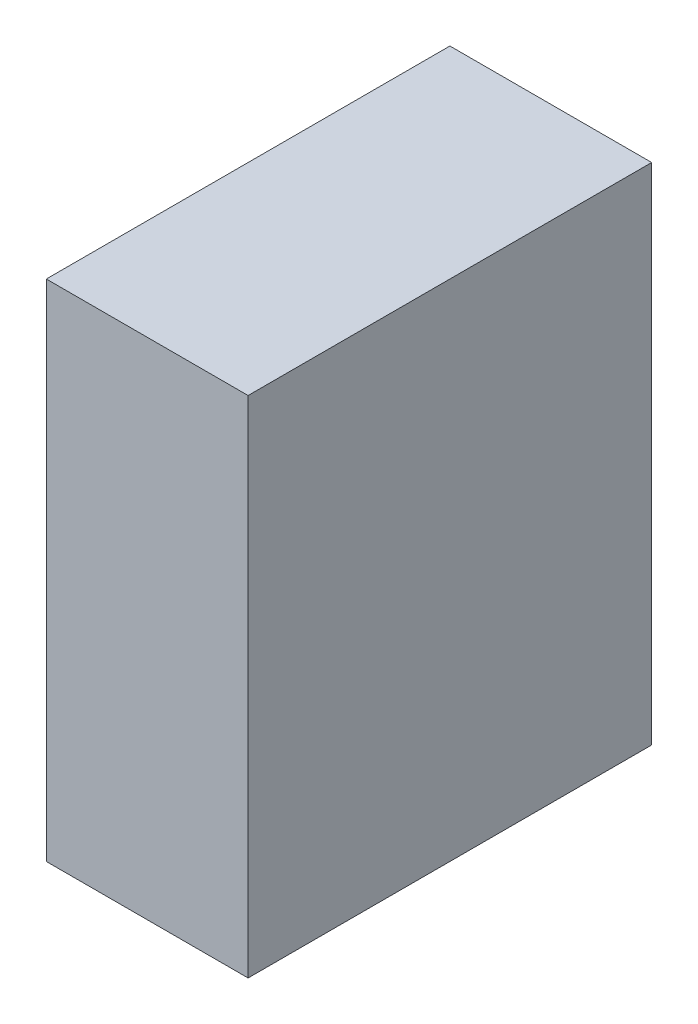
ISO-10303-21;
HEADER;
FILE_DESCRIPTION(('STEP AP214'),'2;1');
FILE_NAME('part.step','',(''),(''),'','','');
FILE_SCHEMA(('AUTOMOTIVE_DESIGN { 1 0 10303 214 1 1 1 1 }'));
ENDSEC;
DATA;
#1=APPLICATION_CONTEXT('core data for automotive mechanical design processes');
#2=APPLICATION_PROTOCOL_DEFINITION('international standard','automotive_design',2000,#1);
#3=PRODUCT_CONTEXT('',#1,'mechanical');
#4=PRODUCT('Part','Part','',(#3));
#5=PRODUCT_RELATED_PRODUCT_CATEGORY('part','',(#4));
#6=PRODUCT_DEFINITION_FORMATION('','',#4);
#7=PRODUCT_DEFINITION_CONTEXT('part definition',#1,'design');
#8=PRODUCT_DEFINITION('design','',#6,#7);
#9=PRODUCT_DEFINITION_SHAPE('','',#8);
#10=(LENGTH_UNIT() NAMED_UNIT(*) SI_UNIT(.MILLI.,.METRE.));
#11=(NAMED_UNIT(*) PLANE_ANGLE_UNIT() SI_UNIT($,.RADIAN.));
#12=(NAMED_UNIT(*) SI_UNIT($,.STERADIAN.) SOLID_ANGLE_UNIT());
#13=UNCERTAINTY_MEASURE_WITH_UNIT(LENGTH_MEASURE(1.E-05),#10,'distance_accuracy_value','');
#14=(GEOMETRIC_REPRESENTATION_CONTEXT(3) GLOBAL_UNCERTAINTY_ASSIGNED_CONTEXT((#13)) GLOBAL_UNIT_ASSIGNED_CONTEXT((#10,
#11,#12)) REPRESENTATION_CONTEXT('',''));
#15=CARTESIAN_POINT('',(0.,0.,0.));
#16=DIRECTION('',(0.,0.,1.));
#17=DIRECTION('',(1.,0.,0.));
#18=AXIS2_PLACEMENT_3D('',#15,#16,#17);
#19=CARTESIAN_POINT('',(20.,100.,-40.));
#20=DIRECTION('',(-1.,0.,0.));
#21=DIRECTION('',(0.,0.,1.));
#22=AXIS2_PLACEMENT_3D('',#19,#20,#21);
#23=PLANE('',#22);
#24=DIRECTION('',(0.,0.,-1.));
#25=VECTOR('',#24,1.);
#26=CARTESIAN_POINT('',(20.,0.,-40.));
#27=LINE('',#26,#25);
#28=CARTESIAN_POINT('',(20.,0.,40.));
#29=VERTEX_POINT('',#28);
#30=CARTESIAN_POINT('',(20.,0.,-40.));
#31=VERTEX_POINT('',#30);
#32=EDGE_CURVE('E117',#29,#31,#27,.T.);
#33=ORIENTED_EDGE('',*,*,#32,.T.);
#34=DIRECTION('',(0.,-1.,0.));
#35=VECTOR('',#34,1.);
#36=CARTESIAN_POINT('',(20.,100.,-40.));
#37=LINE('',#36,#35);
#38=CARTESIAN_POINT('',(20.,100.,-40.));
#39=VERTEX_POINT('',#38);
#40=EDGE_CURVE('E11',#39,#31,#37,.T.);
#41=ORIENTED_EDGE('',*,*,#40,.F.);
#42=DIRECTION('',(0.,0.,-1.));
#43=VECTOR('',#42,1.);
#44=CARTESIAN_POINT('',(20.,100.,-40.));
#45=LINE('',#44,#43);
#46=CARTESIAN_POINT('',(20.,100.,40.));
#47=VERTEX_POINT('',#46);
#48=EDGE_CURVE('E101',#47,#39,#45,.T.);
#49=ORIENTED_EDGE('',*,*,#48,.F.);
#50=DIRECTION('',(0.,-1.,0.));
#51=VECTOR('',#50,1.);
#52=CARTESIAN_POINT('',(20.,100.,40.));
#53=LINE('',#52,#51);
#54=EDGE_CURVE('E113',#47,#29,#53,.T.);
#55=ORIENTED_EDGE('',*,*,#54,.T.);
#56=EDGE_LOOP('',(#33,#41,#49,#55));
#57=FACE_BOUND('',#56,.T.);
#58=ADVANCED_FACE('F49',(#57),#23,.F.);
#59=CARTESIAN_POINT('',(-20.,100.,-40.));
#60=DIRECTION('',(0.,0.,1.));
#61=DIRECTION('',(1.,0.,0.));
#62=AXIS2_PLACEMENT_3D('',#59,#60,#61);
#63=PLANE('',#62);
#64=DIRECTION('',(-1.,0.,0.));
#65=VECTOR('',#64,1.);
#66=CARTESIAN_POINT('',(-20.,0.,-40.));
#67=LINE('',#66,#65);
#68=CARTESIAN_POINT('',(-20.,0.,-40.));
#69=VERTEX_POINT('',#68);
#70=EDGE_CURVE('E106',#31,#69,#67,.T.);
#71=ORIENTED_EDGE('',*,*,#70,.T.);
#72=DIRECTION('',(0.,-1.,0.));
#73=VECTOR('',#72,1.);
#74=CARTESIAN_POINT('',(-20.,100.,-40.));
#75=LINE('',#74,#73);
#76=CARTESIAN_POINT('',(-20.,100.,-40.));
#77=VERTEX_POINT('',#76);
#78=EDGE_CURVE('E58',#77,#69,#75,.T.);
#79=ORIENTED_EDGE('',*,*,#78,.F.);
#80=DIRECTION('',(-1.,0.,0.));
#81=VECTOR('',#80,1.);
#82=CARTESIAN_POINT('',(-20.,100.,-40.));
#83=LINE('',#82,#81);
#84=EDGE_CURVE('E96',#39,#77,#83,.T.);
#85=ORIENTED_EDGE('',*,*,#84,.F.);
#86=ORIENTED_EDGE('',*,*,#40,.T.);
#87=EDGE_LOOP('',(#71,#79,#85,#86));
#88=FACE_BOUND('',#87,.T.);
#89=ADVANCED_FACE('F105',(#88),#63,.F.);
#90=CARTESIAN_POINT('',(-20.,100.,-40.));
#91=DIRECTION('',(1.,0.,0.));
#92=DIRECTION('',(0.,0.,-1.));
#93=AXIS2_PLACEMENT_3D('',#90,#91,#92);
#94=PLANE('',#93);
#95=DIRECTION('',(0.,0.,1.));
#96=VECTOR('',#95,1.);
#97=CARTESIAN_POINT('',(-20.,0.,-40.));
#98=LINE('',#97,#96);
#99=CARTESIAN_POINT('',(-20.,0.,40.));
#100=VERTEX_POINT('',#99);
#101=EDGE_CURVE('E83',#69,#100,#98,.T.);
#102=ORIENTED_EDGE('',*,*,#101,.T.);
#103=DIRECTION('',(0.,-1.,0.));
#104=VECTOR('',#103,1.);
#105=CARTESIAN_POINT('',(-20.,100.,40.));
#106=LINE('',#105,#104);
#107=CARTESIAN_POINT('',(-20.,100.,40.));
#108=VERTEX_POINT('',#107);
#109=EDGE_CURVE('E108',#108,#100,#106,.T.);
#110=ORIENTED_EDGE('',*,*,#109,.F.);
#111=DIRECTION('',(0.,0.,1.));
#112=VECTOR('',#111,1.);
#113=CARTESIAN_POINT('',(-20.,100.,-40.));
#114=LINE('',#113,#112);
#115=EDGE_CURVE('E99',#77,#108,#114,.T.);
#116=ORIENTED_EDGE('',*,*,#115,.F.);
#117=ORIENTED_EDGE('',*,*,#78,.T.);
#118=EDGE_LOOP('',(#102,#110,#116,#117));
#119=FACE_BOUND('',#118,.T.);
#120=ADVANCED_FACE('F109',(#119),#94,.F.);
#121=CARTESIAN_POINT('',(-20.,100.,40.));
#122=DIRECTION('',(0.,0.,-1.));
#123=DIRECTION('',(-1.,0.,0.));
#124=AXIS2_PLACEMENT_3D('',#121,#122,#123);
#125=PLANE('',#124);
#126=DIRECTION('',(1.,0.,0.));
#127=VECTOR('',#126,1.);
#128=CARTESIAN_POINT('',(-20.,0.,40.));
#129=LINE('',#128,#127);
#130=EDGE_CURVE('E89',#100,#29,#129,.T.);
#131=ORIENTED_EDGE('',*,*,#130,.T.);
#132=ORIENTED_EDGE('',*,*,#54,.F.);
#133=DIRECTION('',(1.,0.,0.));
#134=VECTOR('',#133,1.);
#135=CARTESIAN_POINT('',(-20.,100.,40.));
#136=LINE('',#135,#134);
#137=EDGE_CURVE('E66',#108,#47,#136,.T.);
#138=ORIENTED_EDGE('',*,*,#137,.F.);
#139=ORIENTED_EDGE('',*,*,#109,.T.);
#140=EDGE_LOOP('',(#131,#132,#138,#139));
#141=FACE_BOUND('',#140,.T.);
#142=ADVANCED_FACE('F131',(#141),#125,.F.);
#143=CARTESIAN_POINT('',(0.,100.,0.));
#144=DIRECTION('',(0.,1.,0.));
#145=DIRECTION('',(0.,0.,1.));
#146=AXIS2_PLACEMENT_3D('',#143,#144,#145);
#147=PLANE('',#146);
#148=ORIENTED_EDGE('',*,*,#48,.T.);
#149=ORIENTED_EDGE('',*,*,#84,.T.);
#150=ORIENTED_EDGE('',*,*,#115,.T.);
#151=ORIENTED_EDGE('',*,*,#137,.T.);
#152=EDGE_LOOP('',(#148,#149,#150,#151));
#153=FACE_BOUND('',#152,.T.);
#154=ADVANCED_FACE('F97',(#153),#147,.T.);
#155=CARTESIAN_POINT('',(0.,0.,0.));
#156=DIRECTION('',(0.,1.,0.));
#157=DIRECTION('',(0.,0.,1.));
#158=AXIS2_PLACEMENT_3D('',#155,#156,#157);
#159=PLANE('',#158);
#160=CARTESIAN_POINT('',(0.,0.,-22.));
#161=DIRECTION('',(0.,-1.,0.));
#162=DIRECTION('',(0.,0.,-1.));
#163=AXIS2_PLACEMENT_3D('',#160,#161,#162);
#164=CIRCLE('',#163,5.);
#165=CARTESIAN_POINT('',(0.,0.,-27.));
#166=VERTEX_POINT('',#165);
#167=EDGE_CURVE('E150',#166,#166,#164,.T.);
#168=ORIENTED_EDGE('',*,*,#167,.F.);
#169=EDGE_LOOP('',(#168));
#170=FACE_BOUND('',#169,.T.);
#171=CARTESIAN_POINT('',(0.,0.,22.));
#172=DIRECTION('',(0.,-1.,0.));
#173=DIRECTION('',(0.,0.,-1.));
#174=AXIS2_PLACEMENT_3D('',#171,#172,#173);
#175=CIRCLE('',#174,5.);
#176=CARTESIAN_POINT('',(0.,0.,17.));
#177=VERTEX_POINT('',#176);
#178=EDGE_CURVE('E142',#177,#177,#175,.T.);
#179=ORIENTED_EDGE('',*,*,#178,.F.);
#180=EDGE_LOOP('',(#179));
#181=FACE_BOUND('',#180,.T.);
#182=CARTESIAN_POINT('',(0.,0.,0.));
#183=DIRECTION('',(0.,-1.,0.));
#184=DIRECTION('',(0.,0.,-1.));
#185=AXIS2_PLACEMENT_3D('',#182,#183,#184);
#186=CIRCLE('',#185,10.);
#187=CARTESIAN_POINT('',(0.,0.,-10.));
#188=VERTEX_POINT('',#187);
#189=EDGE_CURVE('E138',#188,#188,#186,.T.);
#190=ORIENTED_EDGE('',*,*,#189,.F.);
#191=EDGE_LOOP('',(#190));
#192=FACE_BOUND('',#191,.T.);
#193=ORIENTED_EDGE('',*,*,#32,.F.);
#194=ORIENTED_EDGE('',*,*,#130,.F.);
#195=ORIENTED_EDGE('',*,*,#101,.F.);
#196=ORIENTED_EDGE('',*,*,#70,.F.);
#197=EDGE_LOOP('',(#193,#194,#195,#196));
#198=FACE_BOUND('',#197,.T.);
#199=ADVANCED_FACE('F134',(#170,#181,#192,#198),#159,.F.);
#200=CARTESIAN_POINT('',(0.,20.,0.));
#201=DIRECTION('',(0.,-1.,0.));
#202=DIRECTION('',(0.,0.,-1.));
#203=AXIS2_PLACEMENT_3D('',#200,#201,#202);
#204=CYLINDRICAL_SURFACE('',#203,10.);
#205=CARTESIAN_POINT('',(0.,20.,0.));
#206=DIRECTION('',(0.,-1.,0.));
#207=DIRECTION('',(0.,0.,-1.));
#208=AXIS2_PLACEMENT_3D('',#205,#206,#207);
#209=CIRCLE('',#208,10.);
#210=CARTESIAN_POINT('',(0.,20.,-10.));
#211=VERTEX_POINT('',#210);
#212=EDGE_CURVE('E121',#211,#211,#209,.T.);
#213=ORIENTED_EDGE('',*,*,#212,.F.);
#214=EDGE_LOOP('',(#213));
#215=FACE_BOUND('',#214,.T.);
#216=ORIENTED_EDGE('',*,*,#189,.T.);
#217=EDGE_LOOP('',(#216));
#218=FACE_BOUND('',#217,.T.);
#219=ADVANCED_FACE('F166',(#215,#218),#204,.F.);
#220=CARTESIAN_POINT('',(0.,20.,0.));
#221=DIRECTION('',(0.,-1.,0.));
#222=DIRECTION('',(0.,0.,-1.));
#223=AXIS2_PLACEMENT_3D('',#220,#221,#222);
#224=PLANE('',#223);
#225=ORIENTED_EDGE('',*,*,#212,.T.);
#226=EDGE_LOOP('',(#225));
#227=FACE_BOUND('',#226,.T.);
#228=ADVANCED_FACE('F172',(#227),#224,.T.);
#229=CARTESIAN_POINT('',(0.,20.,22.));
#230=DIRECTION('',(0.,-1.,0.));
#231=DIRECTION('',(0.,0.,-1.));
#232=AXIS2_PLACEMENT_3D('',#229,#230,#231);
#233=CYLINDRICAL_SURFACE('',#232,5.);
#234=CARTESIAN_POINT('',(0.,20.,22.));
#235=DIRECTION('',(0.,-1.,0.));
#236=DIRECTION('',(0.,0.,-1.));
#237=AXIS2_PLACEMENT_3D('',#234,#235,#236);
#238=CIRCLE('',#237,5.);
#239=CARTESIAN_POINT('',(0.,20.,17.));
#240=VERTEX_POINT('',#239);
#241=EDGE_CURVE('E154',#240,#240,#238,.T.);
#242=ORIENTED_EDGE('',*,*,#241,.F.);
#243=EDGE_LOOP('',(#242));
#244=FACE_BOUND('',#243,.T.);
#245=ORIENTED_EDGE('',*,*,#178,.T.);
#246=EDGE_LOOP('',(#245));
#247=FACE_BOUND('',#246,.T.);
#248=ADVANCED_FACE('F162',(#244,#247),#233,.F.);
#249=CARTESIAN_POINT('',(0.,20.,22.));
#250=DIRECTION('',(0.,-1.,0.));
#251=DIRECTION('',(0.,0.,-1.));
#252=AXIS2_PLACEMENT_3D('',#249,#250,#251);
#253=PLANE('',#252);
#254=ORIENTED_EDGE('',*,*,#241,.T.);
#255=EDGE_LOOP('',(#254));
#256=FACE_BOUND('',#255,.T.);
#257=ADVANCED_FACE('F223',(#256),#253,.T.);
#258=CARTESIAN_POINT('',(0.,20.,-22.));
#259=DIRECTION('',(0.,-1.,0.));
#260=DIRECTION('',(0.,0.,-1.));
#261=AXIS2_PLACEMENT_3D('',#258,#259,#260);
#262=CYLINDRICAL_SURFACE('',#261,5.);
#263=CARTESIAN_POINT('',(0.,20.,-22.));
#264=DIRECTION('',(0.,-1.,0.));
#265=DIRECTION('',(0.,0.,-1.));
#266=AXIS2_PLACEMENT_3D('',#263,#264,#265);
#267=CIRCLE('',#266,5.);
#268=CARTESIAN_POINT('',(0.,20.,-27.));
#269=VERTEX_POINT('',#268);
#270=EDGE_CURVE('E146',#269,#269,#267,.T.);
#271=ORIENTED_EDGE('',*,*,#270,.F.);
#272=EDGE_LOOP('',(#271));
#273=FACE_BOUND('',#272,.T.);
#274=ORIENTED_EDGE('',*,*,#167,.T.);
#275=EDGE_LOOP('',(#274));
#276=FACE_BOUND('',#275,.T.);
#277=ADVANCED_FACE('F234',(#273,#276),#262,.F.);
#278=CARTESIAN_POINT('',(0.,20.,-22.));
#279=DIRECTION('',(0.,-1.,0.));
#280=DIRECTION('',(0.,0.,-1.));
#281=AXIS2_PLACEMENT_3D('',#278,#279,#280);
#282=PLANE('',#281);
#283=ORIENTED_EDGE('',*,*,#270,.T.);
#284=EDGE_LOOP('',(#283));
#285=FACE_BOUND('',#284,.T.);
#286=ADVANCED_FACE('F245',(#285),#282,.T.);
#287=CLOSED_SHELL('',(#58,#89,#120,#142,#154,#199,#219,#228,#248,#257,#277,#286));
#288=MANIFOLD_SOLID_BREP('B2',#287);
#289=ADVANCED_BREP_SHAPE_REPRESENTATION('',(#18,#288),#14);
#290=SHAPE_DEFINITION_REPRESENTATION(#9,#289);
ENDSEC;
END-ISO-10303-21;
